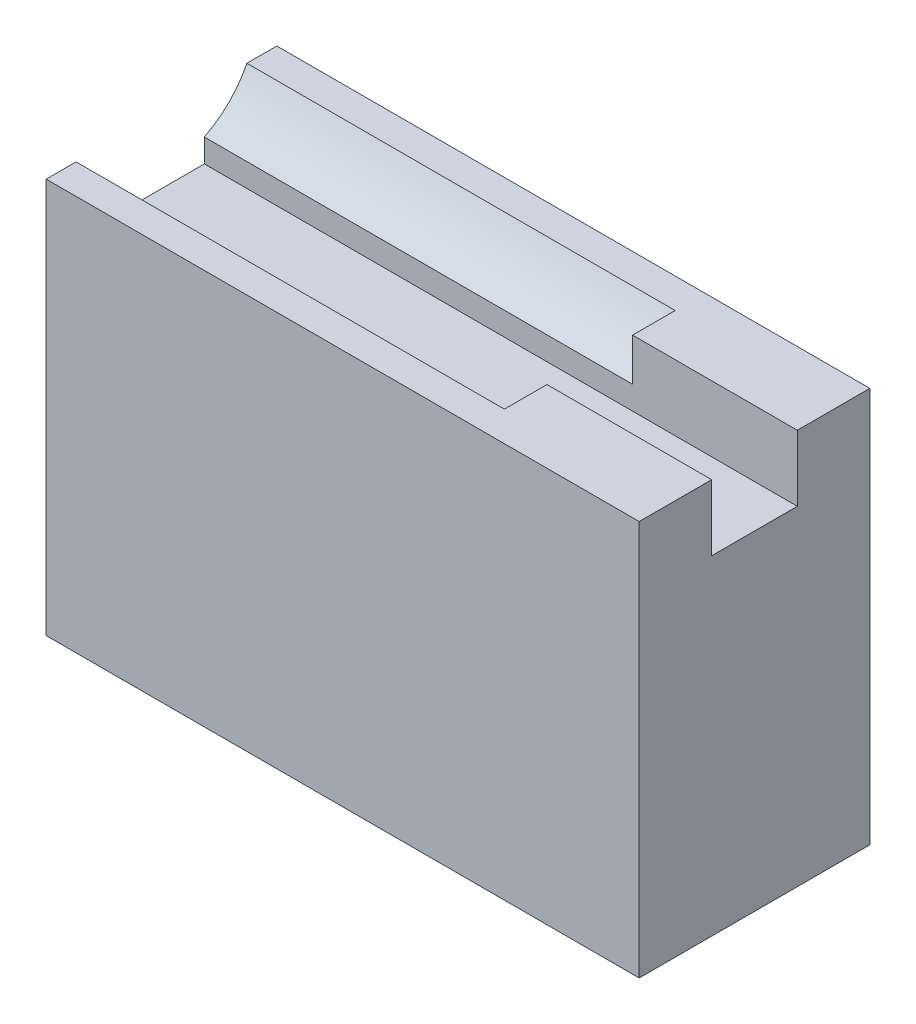
ISO-10303-21;
HEADER;
FILE_DESCRIPTION(('STEP AP214'),'2;1');
FILE_NAME('part.step','',(''),(''),'','','');
FILE_SCHEMA(('AUTOMOTIVE_DESIGN { 1 0 10303 214 1 1 1 1 }'));
ENDSEC;
DATA;
#1=APPLICATION_CONTEXT('core data for automotive mechanical design processes');
#2=APPLICATION_PROTOCOL_DEFINITION('international standard','automotive_design',2000,#1);
#3=PRODUCT_CONTEXT('',#1,'mechanical');
#4=PRODUCT('Part','Part','',(#3));
#5=PRODUCT_RELATED_PRODUCT_CATEGORY('part','',(#4));
#6=PRODUCT_DEFINITION_FORMATION('','',#4);
#7=PRODUCT_DEFINITION_CONTEXT('part definition',#1,'design');
#8=PRODUCT_DEFINITION('design','',#6,#7);
#9=PRODUCT_DEFINITION_SHAPE('','',#8);
#10=(LENGTH_UNIT() NAMED_UNIT(*) SI_UNIT(.MILLI.,.METRE.));
#11=(NAMED_UNIT(*) PLANE_ANGLE_UNIT() SI_UNIT($,.RADIAN.));
#12=(NAMED_UNIT(*) SI_UNIT($,.STERADIAN.) SOLID_ANGLE_UNIT());
#13=UNCERTAINTY_MEASURE_WITH_UNIT(LENGTH_MEASURE(1.E-05),#10,'distance_accuracy_value','');
#14=(GEOMETRIC_REPRESENTATION_CONTEXT(3) GLOBAL_UNCERTAINTY_ASSIGNED_CONTEXT((#13)) GLOBAL_UNIT_ASSIGNED_CONTEXT((#10,
#11,#12)) REPRESENTATION_CONTEXT('',''));
#15=CARTESIAN_POINT('',(0.,0.,0.));
#16=DIRECTION('',(0.,0.,1.));
#17=DIRECTION('',(1.,0.,0.));
#18=AXIS2_PLACEMENT_3D('',#15,#16,#17);
#19=CARTESIAN_POINT('',(0.,60.,0.));
#20=DIRECTION('',(1.,0.,0.));
#21=DIRECTION('',(0.,0.,-1.));
#22=AXIS2_PLACEMENT_3D('',#19,#20,#21);
#23=PLANE('',#22);
#24=DIRECTION('',(0.,-1.,0.));
#25=VECTOR('',#24,1.);
#26=CARTESIAN_POINT('',(0.,60.,11.));
#27=LINE('',#26,#25);
#28=CARTESIAN_POINT('',(0.,53.5385186031843,11.));
#29=VERTEX_POINT('',#28);
#30=CARTESIAN_POINT('',(0.,50.,11.));
#31=VERTEX_POINT('',#30);
#32=EDGE_CURVE('E136',#29,#31,#27,.T.);
#33=ORIENTED_EDGE('',*,*,#32,.F.);
#34=CARTESIAN_POINT('',(0.,66.5,17.5));
#35=DIRECTION('',(1.,0.,0.));
#36=DIRECTION('',(0.,0.,-1.));
#37=AXIS2_PLACEMENT_3D('',#34,#35,#36);
#38=CIRCLE('',#37,14.5);
#39=CARTESIAN_POINT('',(0.,60.,4.53851860318428));
#40=VERTEX_POINT('',#39);
#41=EDGE_CURVE('E157',#29,#40,#38,.T.);
#42=ORIENTED_EDGE('',*,*,#41,.T.);
#43=DIRECTION('',(0.,0.,1.));
#44=VECTOR('',#43,1.);
#45=CARTESIAN_POINT('',(0.,60.,0.));
#46=LINE('',#45,#44);
#47=CARTESIAN_POINT('',(0.,60.,0.));
#48=VERTEX_POINT('',#47);
#49=EDGE_CURVE('E178',#48,#40,#46,.T.);
#50=ORIENTED_EDGE('',*,*,#49,.F.);
#51=DIRECTION('',(0.,-1.,0.));
#52=VECTOR('',#51,1.);
#53=CARTESIAN_POINT('',(0.,60.,0.));
#54=LINE('',#53,#52);
#55=CARTESIAN_POINT('',(0.,0.,0.));
#56=VERTEX_POINT('',#55);
#57=EDGE_CURVE('E189',#48,#56,#54,.T.);
#58=ORIENTED_EDGE('',*,*,#57,.T.);
#59=DIRECTION('',(0.,0.,1.));
#60=VECTOR('',#59,1.);
#61=CARTESIAN_POINT('',(0.,0.,0.));
#62=LINE('',#61,#60);
#63=CARTESIAN_POINT('',(0.,0.,35.));
#64=VERTEX_POINT('',#63);
#65=EDGE_CURVE('E176',#56,#64,#62,.T.);
#66=ORIENTED_EDGE('',*,*,#65,.T.);
#67=DIRECTION('',(0.,-1.,0.));
#68=VECTOR('',#67,1.);
#69=CARTESIAN_POINT('',(0.,60.,35.));
#70=LINE('',#69,#68);
#71=CARTESIAN_POINT('',(0.,60.,35.));
#72=VERTEX_POINT('',#71);
#73=EDGE_CURVE('E40',#72,#64,#70,.T.);
#74=ORIENTED_EDGE('',*,*,#73,.F.);
#75=CARTESIAN_POINT('',(0.,60.,30.4614813968157));
#76=VERTEX_POINT('',#75);
#77=EDGE_CURVE('E182',#76,#72,#46,.T.);
#78=ORIENTED_EDGE('',*,*,#77,.F.);
#79=CARTESIAN_POINT('',(0.,53.5385186031843,24.));
#80=VERTEX_POINT('',#79);
#81=EDGE_CURVE('E153',#76,#80,#38,.T.);
#82=ORIENTED_EDGE('',*,*,#81,.T.);
#83=DIRECTION('',(0.,1.,0.));
#84=VECTOR('',#83,1.);
#85=CARTESIAN_POINT('',(0.,60.,24.));
#86=LINE('',#85,#84);
#87=CARTESIAN_POINT('',(0.,50.,24.));
#88=VERTEX_POINT('',#87);
#89=EDGE_CURVE('E46',#88,#80,#86,.T.);
#90=ORIENTED_EDGE('',*,*,#89,.F.);
#91=DIRECTION('',(0.,0.,1.));
#92=VECTOR('',#91,1.);
#93=CARTESIAN_POINT('',(0.,50.,0.));
#94=LINE('',#93,#92);
#95=EDGE_CURVE('E150',#31,#88,#94,.T.);
#96=ORIENTED_EDGE('',*,*,#95,.F.);
#97=EDGE_LOOP('',(#33,#42,#50,#58,#66,#74,#78,#82,#90,#96));
#98=FACE_BOUND('',#97,.T.);
#99=ADVANCED_FACE('F33',(#98),#23,.F.);
#100=CARTESIAN_POINT('',(90.,60.,0.));
#101=DIRECTION('',(-1.,0.,0.));
#102=DIRECTION('',(0.,0.,1.));
#103=AXIS2_PLACEMENT_3D('',#100,#101,#102);
#104=PLANE('',#103);
#105=DIRECTION('',(0.,1.,0.));
#106=VECTOR('',#105,1.);
#107=CARTESIAN_POINT('',(90.,52.,11.));
#108=LINE('',#107,#106);
#109=CARTESIAN_POINT('',(90.,50.,11.));
#110=VERTEX_POINT('',#109);
#111=CARTESIAN_POINT('',(90.,60.,11.));
#112=VERTEX_POINT('',#111);
#113=EDGE_CURVE('E54',#110,#112,#108,.T.);
#114=ORIENTED_EDGE('',*,*,#113,.F.);
#115=DIRECTION('',(0.,0.,-1.));
#116=VECTOR('',#115,1.);
#117=CARTESIAN_POINT('',(90.,50.,24.));
#118=LINE('',#117,#116);
#119=CARTESIAN_POINT('',(90.,50.,24.));
#120=VERTEX_POINT('',#119);
#121=EDGE_CURVE('E125',#120,#110,#118,.T.);
#122=ORIENTED_EDGE('',*,*,#121,.F.);
#123=DIRECTION('',(0.,1.,0.));
#124=VECTOR('',#123,1.);
#125=CARTESIAN_POINT('',(90.,52.,24.));
#126=LINE('',#125,#124);
#127=CARTESIAN_POINT('',(90.,60.,24.));
#128=VERTEX_POINT('',#127);
#129=EDGE_CURVE('E128',#120,#128,#126,.T.);
#130=ORIENTED_EDGE('',*,*,#129,.T.);
#131=DIRECTION('',(0.,0.,-1.));
#132=VECTOR('',#131,1.);
#133=CARTESIAN_POINT('',(90.,60.,0.));
#134=LINE('',#133,#132);
#135=CARTESIAN_POINT('',(90.,60.,35.));
#136=VERTEX_POINT('',#135);
#137=EDGE_CURVE('E184',#136,#128,#134,.T.);
#138=ORIENTED_EDGE('',*,*,#137,.F.);
#139=DIRECTION('',(0.,-1.,0.));
#140=VECTOR('',#139,1.);
#141=CARTESIAN_POINT('',(90.,60.,35.));
#142=LINE('',#141,#140);
#143=CARTESIAN_POINT('',(90.,0.,35.));
#144=VERTEX_POINT('',#143);
#145=EDGE_CURVE('E203',#136,#144,#142,.T.);
#146=ORIENTED_EDGE('',*,*,#145,.T.);
#147=DIRECTION('',(0.,0.,-1.));
#148=VECTOR('',#147,1.);
#149=CARTESIAN_POINT('',(90.,0.,0.));
#150=LINE('',#149,#148);
#151=CARTESIAN_POINT('',(90.,0.,0.));
#152=VERTEX_POINT('',#151);
#153=EDGE_CURVE('E194',#144,#152,#150,.T.);
#154=ORIENTED_EDGE('',*,*,#153,.T.);
#155=DIRECTION('',(0.,-1.,0.));
#156=VECTOR('',#155,1.);
#157=CARTESIAN_POINT('',(90.,60.,0.));
#158=LINE('',#157,#156);
#159=CARTESIAN_POINT('',(90.,60.,0.));
#160=VERTEX_POINT('',#159);
#161=EDGE_CURVE('E200',#160,#152,#158,.T.);
#162=ORIENTED_EDGE('',*,*,#161,.F.);
#163=EDGE_CURVE('E127',#112,#160,#134,.T.);
#164=ORIENTED_EDGE('',*,*,#163,.F.);
#165=EDGE_LOOP('',(#114,#122,#130,#138,#146,#154,#162,#164));
#166=FACE_BOUND('',#165,.T.);
#167=ADVANCED_FACE('F122',(#166),#104,.F.);
#168=CARTESIAN_POINT('',(0.,66.5,17.5));
#169=DIRECTION('',(1.,0.,0.));
#170=DIRECTION('',(0.,0.,-1.));
#171=AXIS2_PLACEMENT_3D('',#168,#169,#170);
#172=CYLINDRICAL_SURFACE('',#171,14.5);
#173=DIRECTION('',(1.,0.,0.));
#174=VECTOR('',#173,1.);
#175=CARTESIAN_POINT('',(0.,53.5385186031843,11.));
#176=LINE('',#175,#174);
#177=CARTESIAN_POINT('',(65.,53.5385186031843,11.));
#178=VERTEX_POINT('',#177);
#179=EDGE_CURVE('E146',#178,#29,#176,.F.);
#180=ORIENTED_EDGE('',*,*,#179,.F.);
#181=CARTESIAN_POINT('',(65.,66.5,17.5));
#182=DIRECTION('',(1.,0.,0.));
#183=DIRECTION('',(0.,0.,-1.));
#184=AXIS2_PLACEMENT_3D('',#181,#182,#183);
#185=CIRCLE('',#184,14.5);
#186=CARTESIAN_POINT('',(65.,60.,4.53851860318428));
#187=VERTEX_POINT('',#186);
#188=EDGE_CURVE('E152',#178,#187,#185,.T.);
#189=ORIENTED_EDGE('',*,*,#188,.T.);
#190=DIRECTION('',(1.,0.,0.));
#191=VECTOR('',#190,1.);
#192=CARTESIAN_POINT('',(0.,60.,4.53851860318428));
#193=LINE('',#192,#191);
#194=EDGE_CURVE('E168',#187,#40,#193,.F.);
#195=ORIENTED_EDGE('',*,*,#194,.T.);
#196=ORIENTED_EDGE('',*,*,#41,.F.);
#197=EDGE_LOOP('',(#180,#189,#195,#196));
#198=FACE_BOUND('',#197,.T.);
#199=ADVANCED_FACE('F233',(#198),#172,.F.);
#200=DIRECTION('',(1.,0.,0.));
#201=VECTOR('',#200,1.);
#202=CARTESIAN_POINT('',(0.,53.5385186031843,24.));
#203=LINE('',#202,#201);
#204=CARTESIAN_POINT('',(65.,53.5385186031843,24.));
#205=VERTEX_POINT('',#204);
#206=EDGE_CURVE('E11',#80,#205,#203,.T.);
#207=ORIENTED_EDGE('',*,*,#206,.F.);
#208=ORIENTED_EDGE('',*,*,#81,.F.);
#209=DIRECTION('',(1.,0.,0.));
#210=VECTOR('',#209,1.);
#211=CARTESIAN_POINT('',(0.,60.,30.4614813968157));
#212=LINE('',#211,#210);
#213=CARTESIAN_POINT('',(65.,60.,30.4614813968157));
#214=VERTEX_POINT('',#213);
#215=EDGE_CURVE('E171',#76,#214,#212,.T.);
#216=ORIENTED_EDGE('',*,*,#215,.T.);
#217=EDGE_CURVE('E158',#214,#205,#185,.T.);
#218=ORIENTED_EDGE('',*,*,#217,.T.);
#219=EDGE_LOOP('',(#207,#208,#216,#218));
#220=FACE_BOUND('',#219,.T.);
#221=ADVANCED_FACE('F242',(#220),#172,.F.);
#222=CARTESIAN_POINT('',(0.,60.,0.));
#223=DIRECTION('',(0.,1.,0.));
#224=DIRECTION('',(0.,0.,1.));
#225=AXIS2_PLACEMENT_3D('',#222,#223,#224);
#226=PLANE('',#225);
#227=ORIENTED_EDGE('',*,*,#215,.F.);
#228=ORIENTED_EDGE('',*,*,#77,.T.);
#229=DIRECTION('',(1.,0.,0.));
#230=VECTOR('',#229,1.);
#231=CARTESIAN_POINT('',(0.,60.,35.));
#232=LINE('',#231,#230);
#233=EDGE_CURVE('E181',#72,#136,#232,.T.);
#234=ORIENTED_EDGE('',*,*,#233,.T.);
#235=ORIENTED_EDGE('',*,*,#137,.T.);
#236=DIRECTION('',(1.,0.,0.));
#237=VECTOR('',#236,1.);
#238=CARTESIAN_POINT('',(90.,60.,24.));
#239=LINE('',#238,#237);
#240=CARTESIAN_POINT('',(65.,60.,24.));
#241=VERTEX_POINT('',#240);
#242=EDGE_CURVE('E129',#241,#128,#239,.T.);
#243=ORIENTED_EDGE('',*,*,#242,.F.);
#244=DIRECTION('',(0.,0.,-1.));
#245=VECTOR('',#244,1.);
#246=CARTESIAN_POINT('',(65.,60.,0.));
#247=LINE('',#246,#245);
#248=EDGE_CURVE('E165',#214,#241,#247,.T.);
#249=ORIENTED_EDGE('',*,*,#248,.F.);
#250=EDGE_LOOP('',(#227,#228,#234,#235,#243,#249));
#251=FACE_BOUND('',#250,.T.);
#252=ADVANCED_FACE('F239',(#251),#226,.T.);
#253=CARTESIAN_POINT('',(0.,60.,35.));
#254=DIRECTION('',(0.,0.,-1.));
#255=DIRECTION('',(-1.,0.,0.));
#256=AXIS2_PLACEMENT_3D('',#253,#254,#255);
#257=PLANE('',#256);
#258=DIRECTION('',(1.,0.,0.));
#259=VECTOR('',#258,1.);
#260=CARTESIAN_POINT('',(0.,0.,35.));
#261=LINE('',#260,#259);
#262=EDGE_CURVE('E192',#64,#144,#261,.T.);
#263=ORIENTED_EDGE('',*,*,#262,.T.);
#264=ORIENTED_EDGE('',*,*,#145,.F.);
#265=ORIENTED_EDGE('',*,*,#233,.F.);
#266=ORIENTED_EDGE('',*,*,#73,.T.);
#267=EDGE_LOOP('',(#263,#264,#265,#266));
#268=FACE_BOUND('',#267,.T.);
#269=ADVANCED_FACE('F209',(#268),#257,.F.);
#270=CARTESIAN_POINT('',(0.,60.,0.));
#271=DIRECTION('',(0.,0.,1.));
#272=DIRECTION('',(1.,0.,0.));
#273=AXIS2_PLACEMENT_3D('',#270,#271,#272);
#274=PLANE('',#273);
#275=DIRECTION('',(-1.,0.,0.));
#276=VECTOR('',#275,1.);
#277=CARTESIAN_POINT('',(0.,0.,0.));
#278=LINE('',#277,#276);
#279=EDGE_CURVE('E196',#152,#56,#278,.T.);
#280=ORIENTED_EDGE('',*,*,#279,.T.);
#281=ORIENTED_EDGE('',*,*,#57,.F.);
#282=DIRECTION('',(-1.,0.,0.));
#283=VECTOR('',#282,1.);
#284=CARTESIAN_POINT('',(0.,60.,0.));
#285=LINE('',#284,#283);
#286=EDGE_CURVE('E187',#160,#48,#285,.T.);
#287=ORIENTED_EDGE('',*,*,#286,.F.);
#288=ORIENTED_EDGE('',*,*,#161,.T.);
#289=EDGE_LOOP('',(#280,#281,#287,#288));
#290=FACE_BOUND('',#289,.T.);
#291=ADVANCED_FACE('F223',(#290),#274,.F.);
#292=ORIENTED_EDGE('',*,*,#194,.F.);
#293=CARTESIAN_POINT('',(65.,60.,11.));
#294=VERTEX_POINT('',#293);
#295=EDGE_CURVE('E162',#294,#187,#247,.T.);
#296=ORIENTED_EDGE('',*,*,#295,.F.);
#297=DIRECTION('',(-1.,0.,0.));
#298=VECTOR('',#297,1.);
#299=CARTESIAN_POINT('',(90.,60.,11.));
#300=LINE('',#299,#298);
#301=EDGE_CURVE('E173',#112,#294,#300,.T.);
#302=ORIENTED_EDGE('',*,*,#301,.F.);
#303=ORIENTED_EDGE('',*,*,#163,.T.);
#304=ORIENTED_EDGE('',*,*,#286,.T.);
#305=ORIENTED_EDGE('',*,*,#49,.T.);
#306=EDGE_LOOP('',(#292,#296,#302,#303,#304,#305));
#307=FACE_BOUND('',#306,.T.);
#308=ADVANCED_FACE('F226',(#307),#226,.T.);
#309=CARTESIAN_POINT('',(0.,0.,0.));
#310=DIRECTION('',(0.,1.,0.));
#311=DIRECTION('',(0.,0.,1.));
#312=AXIS2_PLACEMENT_3D('',#309,#310,#311);
#313=PLANE('',#312);
#314=ORIENTED_EDGE('',*,*,#65,.F.);
#315=ORIENTED_EDGE('',*,*,#279,.F.);
#316=ORIENTED_EDGE('',*,*,#153,.F.);
#317=ORIENTED_EDGE('',*,*,#262,.F.);
#318=EDGE_LOOP('',(#314,#315,#316,#317));
#319=FACE_BOUND('',#318,.T.);
#320=ADVANCED_FACE('F218',(#319),#313,.F.);
#321=CARTESIAN_POINT('',(90.,52.,24.));
#322=DIRECTION('',(0.,0.,1.));
#323=DIRECTION('',(1.,0.,0.));
#324=AXIS2_PLACEMENT_3D('',#321,#322,#323);
#325=PLANE('',#324);
#326=ORIENTED_EDGE('',*,*,#206,.T.);
#327=DIRECTION('',(0.,1.,0.));
#328=VECTOR('',#327,1.);
#329=CARTESIAN_POINT('',(65.,52.,24.));
#330=LINE('',#329,#328);
#331=EDGE_CURVE('E164',#205,#241,#330,.T.);
#332=ORIENTED_EDGE('',*,*,#331,.T.);
#333=ORIENTED_EDGE('',*,*,#242,.T.);
#334=ORIENTED_EDGE('',*,*,#129,.F.);
#335=DIRECTION('',(1.,0.,0.));
#336=VECTOR('',#335,1.);
#337=CARTESIAN_POINT('',(90.,50.,24.));
#338=LINE('',#337,#336);
#339=EDGE_CURVE('E139',#88,#120,#338,.T.);
#340=ORIENTED_EDGE('',*,*,#339,.F.);
#341=ORIENTED_EDGE('',*,*,#89,.T.);
#342=EDGE_LOOP('',(#326,#332,#333,#334,#340,#341));
#343=FACE_BOUND('',#342,.T.);
#344=ADVANCED_FACE('F235',(#343),#325,.F.);
#345=CARTESIAN_POINT('',(90.,52.,11.));
#346=DIRECTION('',(0.,0.,-1.));
#347=DIRECTION('',(-1.,0.,0.));
#348=AXIS2_PLACEMENT_3D('',#345,#346,#347);
#349=PLANE('',#348);
#350=DIRECTION('',(0.,-1.,0.));
#351=VECTOR('',#350,1.);
#352=CARTESIAN_POINT('',(65.,52.,11.));
#353=LINE('',#352,#351);
#354=EDGE_CURVE('E156',#294,#178,#353,.T.);
#355=ORIENTED_EDGE('',*,*,#354,.T.);
#356=ORIENTED_EDGE('',*,*,#179,.T.);
#357=ORIENTED_EDGE('',*,*,#32,.T.);
#358=DIRECTION('',(-1.,0.,0.));
#359=VECTOR('',#358,1.);
#360=CARTESIAN_POINT('',(90.,50.,11.));
#361=LINE('',#360,#359);
#362=EDGE_CURVE('E132',#110,#31,#361,.T.);
#363=ORIENTED_EDGE('',*,*,#362,.F.);
#364=ORIENTED_EDGE('',*,*,#113,.T.);
#365=ORIENTED_EDGE('',*,*,#301,.T.);
#366=EDGE_LOOP('',(#355,#356,#357,#363,#364,#365));
#367=FACE_BOUND('',#366,.T.);
#368=ADVANCED_FACE('F134',(#367),#349,.F.);
#369=CARTESIAN_POINT('',(65.,66.5,17.5));
#370=DIRECTION('',(1.,0.,0.));
#371=DIRECTION('',(0.,0.,-1.));
#372=AXIS2_PLACEMENT_3D('',#369,#370,#371);
#373=PLANE('',#372);
#374=ORIENTED_EDGE('',*,*,#248,.T.);
#375=ORIENTED_EDGE('',*,*,#331,.F.);
#376=ORIENTED_EDGE('',*,*,#217,.F.);
#377=EDGE_LOOP('',(#374,#375,#376));
#378=FACE_BOUND('',#377,.T.);
#379=ADVANCED_FACE('F246',(#378),#373,.F.);
#380=ORIENTED_EDGE('',*,*,#295,.T.);
#381=ORIENTED_EDGE('',*,*,#188,.F.);
#382=ORIENTED_EDGE('',*,*,#354,.F.);
#383=EDGE_LOOP('',(#380,#381,#382));
#384=FACE_BOUND('',#383,.T.);
#385=ADVANCED_FACE('F230',(#384),#373,.F.);
#386=CARTESIAN_POINT('',(0.,50.,0.));
#387=DIRECTION('',(0.,1.,0.));
#388=DIRECTION('',(0.,0.,1.));
#389=AXIS2_PLACEMENT_3D('',#386,#387,#388);
#390=PLANE('',#389);
#391=ORIENTED_EDGE('',*,*,#95,.T.);
#392=ORIENTED_EDGE('',*,*,#339,.T.);
#393=ORIENTED_EDGE('',*,*,#121,.T.);
#394=ORIENTED_EDGE('',*,*,#362,.T.);
#395=EDGE_LOOP('',(#391,#392,#393,#394));
#396=FACE_BOUND('',#395,.T.);
#397=ADVANCED_FACE('F142',(#396),#390,.T.);
#398=CLOSED_SHELL('',(#99,#167,#199,#221,#252,#269,#291,#308,#320,#344,#368,#379,#385,#397));
#399=MANIFOLD_SOLID_BREP('B2',#398);
#400=ADVANCED_BREP_SHAPE_REPRESENTATION('',(#18,#399),#14);
#401=SHAPE_DEFINITION_REPRESENTATION(#9,#400);
ENDSEC;
END-ISO-10303-21;
